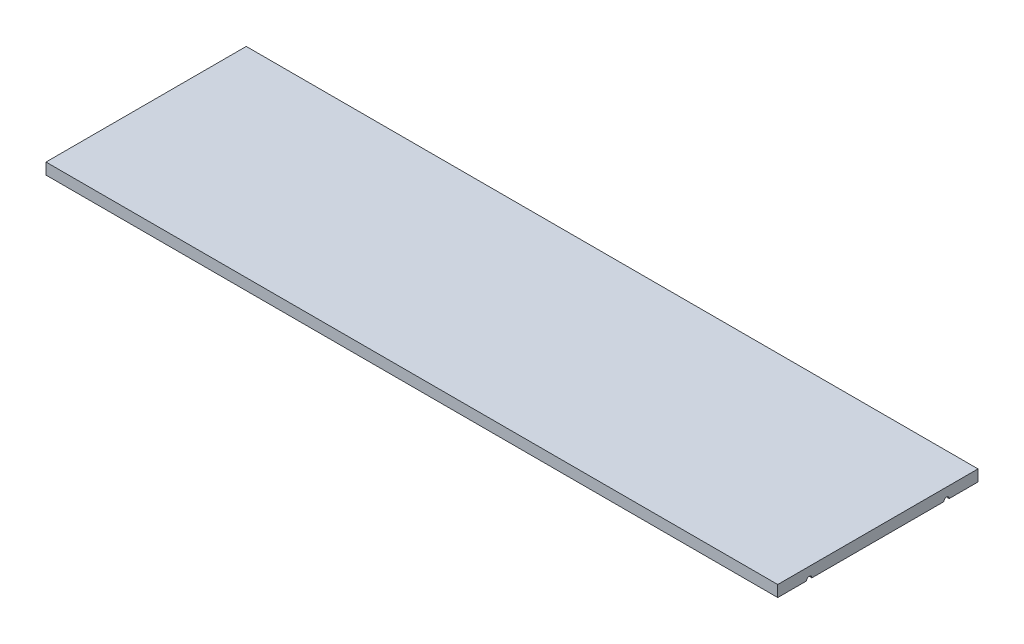
ISO-10303-21;
HEADER;
FILE_DESCRIPTION(('STEP AP214'),'2;1');
FILE_NAME('part.step','',(''),(''),'','','');
FILE_SCHEMA(('AUTOMOTIVE_DESIGN { 1 0 10303 214 1 1 1 1 }'));
ENDSEC;
DATA;
#1=APPLICATION_CONTEXT('core data for automotive mechanical design processes');
#2=APPLICATION_PROTOCOL_DEFINITION('international standard','automotive_design',2000,#1);
#3=PRODUCT_CONTEXT('',#1,'mechanical');
#4=PRODUCT('Part','Part','',(#3));
#5=PRODUCT_RELATED_PRODUCT_CATEGORY('part','',(#4));
#6=PRODUCT_DEFINITION_FORMATION('','',#4);
#7=PRODUCT_DEFINITION_CONTEXT('part definition',#1,'design');
#8=PRODUCT_DEFINITION('design','',#6,#7);
#9=PRODUCT_DEFINITION_SHAPE('','',#8);
#10=(LENGTH_UNIT() NAMED_UNIT(*) SI_UNIT(.MILLI.,.METRE.));
#11=(NAMED_UNIT(*) PLANE_ANGLE_UNIT() SI_UNIT($,.RADIAN.));
#12=(NAMED_UNIT(*) SI_UNIT($,.STERADIAN.) SOLID_ANGLE_UNIT());
#13=UNCERTAINTY_MEASURE_WITH_UNIT(LENGTH_MEASURE(1.E-05),#10,'distance_accuracy_value','');
#14=(GEOMETRIC_REPRESENTATION_CONTEXT(3) GLOBAL_UNCERTAINTY_ASSIGNED_CONTEXT((#13)) GLOBAL_UNIT_ASSIGNED_CONTEXT((#10,
#11,#12)) REPRESENTATION_CONTEXT('',''));
#15=CARTESIAN_POINT('',(0.,0.,0.));
#16=DIRECTION('',(0.,0.,1.));
#17=DIRECTION('',(1.,0.,0.));
#18=AXIS2_PLACEMENT_3D('',#15,#16,#17);
#19=CARTESIAN_POINT('',(-1162.,1204.72735504761,-318.));
#20=DIRECTION('',(1.,0.,0.));
#21=DIRECTION('',(0.,0.,-1.));
#22=AXIS2_PLACEMENT_3D('',#19,#20,#21);
#23=PLANE('',#22);
#24=CARTESIAN_POINT('',(-1162.,-18.,-268.));
#25=DIRECTION('',(1.,0.,0.));
#26=DIRECTION('',(0.,0.,-1.));
#27=AXIS2_PLACEMENT_3D('',#24,#25,#26);
#28=CIRCLE('',#27,4.24999999999995);
#29=CARTESIAN_POINT('',(-1162.,-18.,-272.25));
#30=VERTEX_POINT('',#29);
#31=CARTESIAN_POINT('',(-1162.,-18.,-263.75));
#32=VERTEX_POINT('',#31);
#33=EDGE_CURVE('E153',#30,#32,#28,.T.);
#34=ORIENTED_EDGE('',*,*,#33,.T.);
#35=DIRECTION('',(0.,0.,1.));
#36=VECTOR('',#35,1.);
#37=CARTESIAN_POINT('',(-1162.,-18.,-318.));
#38=LINE('',#37,#36);
#39=CARTESIAN_POINT('',(-1162.,-18.,-54.25));
#40=VERTEX_POINT('',#39);
#41=EDGE_CURVE('E185',#32,#40,#38,.T.);
#42=ORIENTED_EDGE('',*,*,#41,.T.);
#43=CARTESIAN_POINT('',(-1162.,-18.,-50.));
#44=DIRECTION('',(1.,0.,0.));
#45=DIRECTION('',(0.,0.,-1.));
#46=AXIS2_PLACEMENT_3D('',#43,#44,#45);
#47=CIRCLE('',#46,4.25);
#48=CARTESIAN_POINT('',(-1162.,-18.,-45.75));
#49=VERTEX_POINT('',#48);
#50=EDGE_CURVE('E159',#40,#49,#47,.T.);
#51=ORIENTED_EDGE('',*,*,#50,.T.);
#52=CARTESIAN_POINT('',(-1162.,-18.,0.));
#53=VERTEX_POINT('',#52);
#54=EDGE_CURVE('E186',#49,#53,#38,.T.);
#55=ORIENTED_EDGE('',*,*,#54,.T.);
#56=DIRECTION('',(0.,-1.,0.));
#57=VECTOR('',#56,1.);
#58=CARTESIAN_POINT('',(-1162.,1204.72735504761,0.));
#59=LINE('',#58,#57);
#60=CARTESIAN_POINT('',(-1162.,0.,0.));
#61=VERTEX_POINT('',#60);
#62=EDGE_CURVE('E181',#61,#53,#59,.T.);
#63=ORIENTED_EDGE('',*,*,#62,.F.);
#64=DIRECTION('',(0.,0.,1.));
#65=VECTOR('',#64,1.);
#66=CARTESIAN_POINT('',(-1162.,0.,-318.));
#67=LINE('',#66,#65);
#68=CARTESIAN_POINT('',(-1162.,0.,-318.));
#69=VERTEX_POINT('',#68);
#70=EDGE_CURVE('E194',#69,#61,#67,.T.);
#71=ORIENTED_EDGE('',*,*,#70,.F.);
#72=DIRECTION('',(0.,-1.,0.));
#73=VECTOR('',#72,1.);
#74=CARTESIAN_POINT('',(-1162.,1204.72735504761,-318.));
#75=LINE('',#74,#73);
#76=CARTESIAN_POINT('',(-1162.,-18.,-318.));
#77=VERTEX_POINT('',#76);
#78=EDGE_CURVE('E165',#69,#77,#75,.T.);
#79=ORIENTED_EDGE('',*,*,#78,.T.);
#80=EDGE_CURVE('E182',#77,#30,#38,.T.);
#81=ORIENTED_EDGE('',*,*,#80,.T.);
#82=EDGE_LOOP('',(#34,#42,#51,#55,#63,#71,#79,#81));
#83=FACE_BOUND('',#82,.T.);
#84=ADVANCED_FACE('F34',(#83),#23,.F.);
#85=CARTESIAN_POINT('',(-1162.,-18.,0.));
#86=DIRECTION('',(0.,1.,0.));
#87=DIRECTION('',(0.,0.,1.));
#88=AXIS2_PLACEMENT_3D('',#85,#86,#87);
#89=PLANE('',#88);
#90=DIRECTION('',(0.,0.,-1.));
#91=VECTOR('',#90,1.);
#92=CARTESIAN_POINT('',(-18.,-18.,-45.75));
#93=LINE('',#92,#91);
#94=CARTESIAN_POINT('',(-18.,-18.,-45.75));
#95=VERTEX_POINT('',#94);
#96=CARTESIAN_POINT('',(-18.,-18.,-54.25));
#97=VERTEX_POINT('',#96);
#98=EDGE_CURVE('E132',#95,#97,#93,.T.);
#99=ORIENTED_EDGE('',*,*,#98,.F.);
#100=DIRECTION('',(1.,0.,0.));
#101=VECTOR('',#100,1.);
#102=CARTESIAN_POINT('',(-18.,-18.,-45.75));
#103=LINE('',#102,#101);
#104=CARTESIAN_POINT('',(0.,-18.,-45.75));
#105=VERTEX_POINT('',#104);
#106=EDGE_CURVE('E122',#95,#105,#103,.T.);
#107=ORIENTED_EDGE('',*,*,#106,.T.);
#108=DIRECTION('',(0.,0.,-1.));
#109=VECTOR('',#108,1.);
#110=CARTESIAN_POINT('',(0.,-18.,-318.));
#111=LINE('',#110,#109);
#112=CARTESIAN_POINT('',(0.,-18.,0.));
#113=VERTEX_POINT('',#112);
#114=EDGE_CURVE('E173',#113,#105,#111,.T.);
#115=ORIENTED_EDGE('',*,*,#114,.F.);
#116=DIRECTION('',(1.,0.,0.));
#117=VECTOR('',#116,1.);
#118=CARTESIAN_POINT('',(-1162.,-18.,0.));
#119=LINE('',#118,#117);
#120=EDGE_CURVE('E177',#53,#113,#119,.T.);
#121=ORIENTED_EDGE('',*,*,#120,.F.);
#122=ORIENTED_EDGE('',*,*,#54,.F.);
#123=DIRECTION('',(-1.,0.,0.));
#124=VECTOR('',#123,1.);
#125=CARTESIAN_POINT('',(-1144.,-18.,-45.75));
#126=LINE('',#125,#124);
#127=CARTESIAN_POINT('',(-1144.,-18.,-45.75));
#128=VERTEX_POINT('',#127);
#129=EDGE_CURVE('E207',#128,#49,#126,.T.);
#130=ORIENTED_EDGE('',*,*,#129,.F.);
#131=DIRECTION('',(0.,0.,-1.));
#132=VECTOR('',#131,1.);
#133=CARTESIAN_POINT('',(-1144.,-18.,0.));
#134=LINE('',#133,#132);
#135=CARTESIAN_POINT('',(-1144.,-18.,-54.25));
#136=VERTEX_POINT('',#135);
#137=EDGE_CURVE('E190',#128,#136,#134,.T.);
#138=ORIENTED_EDGE('',*,*,#137,.T.);
#139=DIRECTION('',(-1.,0.,0.));
#140=VECTOR('',#139,1.);
#141=CARTESIAN_POINT('',(-1144.,-18.,-54.25));
#142=LINE('',#141,#140);
#143=EDGE_CURVE('E209',#40,#136,#142,.F.);
#144=ORIENTED_EDGE('',*,*,#143,.F.);
#145=ORIENTED_EDGE('',*,*,#41,.F.);
#146=DIRECTION('',(-1.,0.,0.));
#147=VECTOR('',#146,1.);
#148=CARTESIAN_POINT('',(-1144.,-18.,-263.75));
#149=LINE('',#148,#147);
#150=CARTESIAN_POINT('',(-1144.,-18.,-263.75));
#151=VERTEX_POINT('',#150);
#152=EDGE_CURVE('E42',#151,#32,#149,.T.);
#153=ORIENTED_EDGE('',*,*,#152,.F.);
#154=DIRECTION('',(0.,0.,-1.));
#155=VECTOR('',#154,1.);
#156=CARTESIAN_POINT('',(-1144.,-18.,0.));
#157=LINE('',#156,#155);
#158=CARTESIAN_POINT('',(-1144.,-18.,-272.25));
#159=VERTEX_POINT('',#158);
#160=EDGE_CURVE('E212',#151,#159,#157,.T.);
#161=ORIENTED_EDGE('',*,*,#160,.T.);
#162=DIRECTION('',(-1.,0.,0.));
#163=VECTOR('',#162,1.);
#164=CARTESIAN_POINT('',(-1144.,-18.,-272.25));
#165=LINE('',#164,#163);
#166=EDGE_CURVE('E11',#30,#159,#165,.F.);
#167=ORIENTED_EDGE('',*,*,#166,.F.);
#168=ORIENTED_EDGE('',*,*,#80,.F.);
#169=DIRECTION('',(-1.,0.,0.));
#170=VECTOR('',#169,1.);
#171=CARTESIAN_POINT('',(-1162.,-18.,-318.));
#172=LINE('',#171,#170);
#173=CARTESIAN_POINT('',(0.,-18.,-318.));
#174=VERTEX_POINT('',#173);
#175=EDGE_CURVE('E168',#174,#77,#172,.T.);
#176=ORIENTED_EDGE('',*,*,#175,.F.);
#177=CARTESIAN_POINT('',(0.,-18.,-272.25));
#178=VERTEX_POINT('',#177);
#179=EDGE_CURVE('E176',#178,#174,#111,.T.);
#180=ORIENTED_EDGE('',*,*,#179,.F.);
#181=DIRECTION('',(1.,0.,0.));
#182=VECTOR('',#181,1.);
#183=CARTESIAN_POINT('',(-18.,-18.,-272.25));
#184=LINE('',#183,#182);
#185=CARTESIAN_POINT('',(-18.,-18.,-272.25));
#186=VERTEX_POINT('',#185);
#187=EDGE_CURVE('E57',#186,#178,#184,.T.);
#188=ORIENTED_EDGE('',*,*,#187,.F.);
#189=DIRECTION('',(0.,0.,-1.));
#190=VECTOR('',#189,1.);
#191=CARTESIAN_POINT('',(-18.,-18.,-263.75));
#192=LINE('',#191,#190);
#193=CARTESIAN_POINT('',(-18.,-18.,-263.75));
#194=VERTEX_POINT('',#193);
#195=EDGE_CURVE('E147',#194,#186,#192,.T.);
#196=ORIENTED_EDGE('',*,*,#195,.F.);
#197=DIRECTION('',(1.,0.,0.));
#198=VECTOR('',#197,1.);
#199=CARTESIAN_POINT('',(-18.,-18.,-263.75));
#200=LINE('',#199,#198);
#201=CARTESIAN_POINT('',(0.,-18.,-263.75));
#202=VERTEX_POINT('',#201);
#203=EDGE_CURVE('E150',#194,#202,#200,.T.);
#204=ORIENTED_EDGE('',*,*,#203,.T.);
#205=CARTESIAN_POINT('',(0.,-18.,-54.25));
#206=VERTEX_POINT('',#205);
#207=EDGE_CURVE('E175',#206,#202,#111,.T.);
#208=ORIENTED_EDGE('',*,*,#207,.F.);
#209=DIRECTION('',(1.,0.,0.));
#210=VECTOR('',#209,1.);
#211=CARTESIAN_POINT('',(-18.,-18.,-54.25));
#212=LINE('',#211,#210);
#213=EDGE_CURVE('E49',#97,#206,#212,.T.);
#214=ORIENTED_EDGE('',*,*,#213,.F.);
#215=EDGE_LOOP('',(#99,#107,#115,#121,#122,#130,#138,#144,#145,#153,#161,#167,#168,#176,#180,
#188,#196,#204,#208,#214));
#216=FACE_BOUND('',#215,.T.);
#217=ADVANCED_FACE('F137',(#216),#89,.F.);
#218=CARTESIAN_POINT('',(-1162.,1204.72735504761,0.));
#219=DIRECTION('',(0.,0.,-1.));
#220=DIRECTION('',(-1.,0.,0.));
#221=AXIS2_PLACEMENT_3D('',#218,#219,#220);
#222=PLANE('',#221);
#223=DIRECTION('',(1.,0.,0.));
#224=VECTOR('',#223,1.);
#225=CARTESIAN_POINT('',(-1162.,0.,0.));
#226=LINE('',#225,#224);
#227=CARTESIAN_POINT('',(0.,0.,0.));
#228=VERTEX_POINT('',#227);
#229=EDGE_CURVE('E191',#61,#228,#226,.T.);
#230=ORIENTED_EDGE('',*,*,#229,.F.);
#231=ORIENTED_EDGE('',*,*,#62,.T.);
#232=ORIENTED_EDGE('',*,*,#120,.T.);
#233=DIRECTION('',(0.,-1.,0.));
#234=VECTOR('',#233,1.);
#235=CARTESIAN_POINT('',(0.,1204.72735504761,0.));
#236=LINE('',#235,#234);
#237=EDGE_CURVE('E180',#228,#113,#236,.T.);
#238=ORIENTED_EDGE('',*,*,#237,.F.);
#239=EDGE_LOOP('',(#230,#231,#232,#238));
#240=FACE_BOUND('',#239,.T.);
#241=ADVANCED_FACE('F229',(#240),#222,.F.);
#242=CARTESIAN_POINT('',(0.,1204.72735504761,-318.));
#243=DIRECTION('',(-1.,0.,0.));
#244=DIRECTION('',(0.,0.,1.));
#245=AXIS2_PLACEMENT_3D('',#242,#243,#244);
#246=PLANE('',#245);
#247=ORIENTED_EDGE('',*,*,#114,.T.);
#248=CARTESIAN_POINT('',(0.,-18.,-50.));
#249=DIRECTION('',(1.,0.,0.));
#250=DIRECTION('',(0.,0.,-1.));
#251=AXIS2_PLACEMENT_3D('',#248,#249,#250);
#252=CIRCLE('',#251,4.25);
#253=EDGE_CURVE('E127',#206,#105,#252,.T.);
#254=ORIENTED_EDGE('',*,*,#253,.F.);
#255=ORIENTED_EDGE('',*,*,#207,.T.);
#256=CARTESIAN_POINT('',(0.,-18.,-268.));
#257=DIRECTION('',(1.,0.,0.));
#258=DIRECTION('',(0.,0.,-1.));
#259=AXIS2_PLACEMENT_3D('',#256,#257,#258);
#260=CIRCLE('',#259,4.24999999999998);
#261=EDGE_CURVE('E142',#178,#202,#260,.T.);
#262=ORIENTED_EDGE('',*,*,#261,.F.);
#263=ORIENTED_EDGE('',*,*,#179,.T.);
#264=DIRECTION('',(0.,-1.,0.));
#265=VECTOR('',#264,1.);
#266=CARTESIAN_POINT('',(0.,1204.72735504761,-318.));
#267=LINE('',#266,#265);
#268=CARTESIAN_POINT('',(0.,0.,-318.));
#269=VERTEX_POINT('',#268);
#270=EDGE_CURVE('E172',#269,#174,#267,.T.);
#271=ORIENTED_EDGE('',*,*,#270,.F.);
#272=DIRECTION('',(0.,0.,-1.));
#273=VECTOR('',#272,1.);
#274=CARTESIAN_POINT('',(0.,0.,-318.));
#275=LINE('',#274,#273);
#276=EDGE_CURVE('E187',#228,#269,#275,.T.);
#277=ORIENTED_EDGE('',*,*,#276,.F.);
#278=ORIENTED_EDGE('',*,*,#237,.T.);
#279=EDGE_LOOP('',(#247,#254,#255,#262,#263,#271,#277,#278));
#280=FACE_BOUND('',#279,.T.);
#281=ADVANCED_FACE('F232',(#280),#246,.F.);
#282=CARTESIAN_POINT('',(-1162.,1204.72735504761,-318.));
#283=DIRECTION('',(0.,0.,1.));
#284=DIRECTION('',(1.,0.,0.));
#285=AXIS2_PLACEMENT_3D('',#282,#283,#284);
#286=PLANE('',#285);
#287=DIRECTION('',(-1.,0.,0.));
#288=VECTOR('',#287,1.);
#289=CARTESIAN_POINT('',(-1162.,0.,-318.));
#290=LINE('',#289,#288);
#291=EDGE_CURVE('E171',#269,#69,#290,.T.);
#292=ORIENTED_EDGE('',*,*,#291,.F.);
#293=ORIENTED_EDGE('',*,*,#270,.T.);
#294=ORIENTED_EDGE('',*,*,#175,.T.);
#295=ORIENTED_EDGE('',*,*,#78,.F.);
#296=EDGE_LOOP('',(#292,#293,#294,#295));
#297=FACE_BOUND('',#296,.T.);
#298=ADVANCED_FACE('F237',(#297),#286,.F.);
#299=CARTESIAN_POINT('',(0.,0.,0.));
#300=DIRECTION('',(0.,1.,0.));
#301=DIRECTION('',(0.,0.,1.));
#302=AXIS2_PLACEMENT_3D('',#299,#300,#301);
#303=PLANE('',#302);
#304=ORIENTED_EDGE('',*,*,#291,.T.);
#305=ORIENTED_EDGE('',*,*,#70,.T.);
#306=ORIENTED_EDGE('',*,*,#229,.T.);
#307=ORIENTED_EDGE('',*,*,#276,.T.);
#308=EDGE_LOOP('',(#304,#305,#306,#307));
#309=FACE_BOUND('',#308,.T.);
#310=ADVANCED_FACE('F36',(#309),#303,.T.);
#311=CARTESIAN_POINT('',(-1144.,-18.,-50.));
#312=DIRECTION('',(-1.,0.,0.));
#313=DIRECTION('',(0.,0.,1.));
#314=AXIS2_PLACEMENT_3D('',#311,#312,#313);
#315=CYLINDRICAL_SURFACE('',#314,4.25);
#316=ORIENTED_EDGE('',*,*,#143,.T.);
#317=CARTESIAN_POINT('',(-1144.,-18.,-50.));
#318=DIRECTION('',(1.,0.,0.));
#319=DIRECTION('',(0.,0.,-1.));
#320=AXIS2_PLACEMENT_3D('',#317,#318,#319);
#321=CIRCLE('',#320,4.25);
#322=EDGE_CURVE('E162',#136,#128,#321,.T.);
#323=ORIENTED_EDGE('',*,*,#322,.T.);
#324=ORIENTED_EDGE('',*,*,#129,.T.);
#325=ORIENTED_EDGE('',*,*,#50,.F.);
#326=EDGE_LOOP('',(#316,#323,#324,#325));
#327=FACE_BOUND('',#326,.T.);
#328=ADVANCED_FACE('F264',(#327),#315,.F.);
#329=CARTESIAN_POINT('',(-1144.,-18.,-50.));
#330=DIRECTION('',(1.,0.,0.));
#331=DIRECTION('',(0.,0.,-1.));
#332=AXIS2_PLACEMENT_3D('',#329,#330,#331);
#333=PLANE('',#332);
#334=ORIENTED_EDGE('',*,*,#322,.F.);
#335=ORIENTED_EDGE('',*,*,#137,.F.);
#336=EDGE_LOOP('',(#334,#335));
#337=FACE_BOUND('',#336,.T.);
#338=ADVANCED_FACE('F250',(#337),#333,.F.);
#339=CARTESIAN_POINT('',(-1144.,-18.,-268.));
#340=DIRECTION('',(-1.,0.,0.));
#341=DIRECTION('',(0.,0.,1.));
#342=AXIS2_PLACEMENT_3D('',#339,#340,#341);
#343=CYLINDRICAL_SURFACE('',#342,4.24999999999995);
#344=ORIENTED_EDGE('',*,*,#166,.T.);
#345=CARTESIAN_POINT('',(-1144.,-18.,-268.));
#346=DIRECTION('',(1.,0.,0.));
#347=DIRECTION('',(0.,0.,-1.));
#348=AXIS2_PLACEMENT_3D('',#345,#346,#347);
#349=CIRCLE('',#348,4.24999999999995);
#350=EDGE_CURVE('E156',#159,#151,#349,.T.);
#351=ORIENTED_EDGE('',*,*,#350,.T.);
#352=ORIENTED_EDGE('',*,*,#152,.T.);
#353=ORIENTED_EDGE('',*,*,#33,.F.);
#354=EDGE_LOOP('',(#344,#351,#352,#353));
#355=FACE_BOUND('',#354,.T.);
#356=ADVANCED_FACE('F216',(#355),#343,.F.);
#357=CARTESIAN_POINT('',(-1144.,-18.,-268.));
#358=DIRECTION('',(1.,0.,0.));
#359=DIRECTION('',(0.,0.,-1.));
#360=AXIS2_PLACEMENT_3D('',#357,#358,#359);
#361=PLANE('',#360);
#362=ORIENTED_EDGE('',*,*,#350,.F.);
#363=ORIENTED_EDGE('',*,*,#160,.F.);
#364=EDGE_LOOP('',(#362,#363));
#365=FACE_BOUND('',#364,.T.);
#366=ADVANCED_FACE('F240',(#365),#361,.F.);
#367=CARTESIAN_POINT('',(-18.,-18.,-268.));
#368=DIRECTION('',(1.,0.,0.));
#369=DIRECTION('',(0.,0.,-1.));
#370=AXIS2_PLACEMENT_3D('',#367,#368,#369);
#371=CYLINDRICAL_SURFACE('',#370,4.24999999999998);
#372=ORIENTED_EDGE('',*,*,#261,.T.);
#373=ORIENTED_EDGE('',*,*,#203,.F.);
#374=CARTESIAN_POINT('',(-18.,-18.,-268.));
#375=DIRECTION('',(1.,0.,0.));
#376=DIRECTION('',(0.,0.,-1.));
#377=AXIS2_PLACEMENT_3D('',#374,#375,#376);
#378=CIRCLE('',#377,4.24999999999998);
#379=EDGE_CURVE('E144',#186,#194,#378,.T.);
#380=ORIENTED_EDGE('',*,*,#379,.F.);
#381=ORIENTED_EDGE('',*,*,#187,.T.);
#382=EDGE_LOOP('',(#372,#373,#380,#381));
#383=FACE_BOUND('',#382,.T.);
#384=ADVANCED_FACE('F242',(#383),#371,.F.);
#385=CARTESIAN_POINT('',(-18.,-18.,-268.));
#386=DIRECTION('',(1.,0.,0.));
#387=DIRECTION('',(0.,0.,-1.));
#388=AXIS2_PLACEMENT_3D('',#385,#386,#387);
#389=PLANE('',#388);
#390=ORIENTED_EDGE('',*,*,#379,.T.);
#391=ORIENTED_EDGE('',*,*,#195,.T.);
#392=EDGE_LOOP('',(#390,#391));
#393=FACE_BOUND('',#392,.T.);
#394=ADVANCED_FACE('F248',(#393),#389,.T.);
#395=CARTESIAN_POINT('',(-18.,-18.,-50.));
#396=DIRECTION('',(1.,0.,0.));
#397=DIRECTION('',(0.,0.,-1.));
#398=AXIS2_PLACEMENT_3D('',#395,#396,#397);
#399=CYLINDRICAL_SURFACE('',#398,4.25);
#400=ORIENTED_EDGE('',*,*,#253,.T.);
#401=ORIENTED_EDGE('',*,*,#106,.F.);
#402=CARTESIAN_POINT('',(-18.,-18.,-50.));
#403=DIRECTION('',(1.,0.,0.));
#404=DIRECTION('',(0.,0.,-1.));
#405=AXIS2_PLACEMENT_3D('',#402,#403,#404);
#406=CIRCLE('',#405,4.25);
#407=EDGE_CURVE('E125',#97,#95,#406,.T.);
#408=ORIENTED_EDGE('',*,*,#407,.F.);
#409=ORIENTED_EDGE('',*,*,#213,.T.);
#410=EDGE_LOOP('',(#400,#401,#408,#409));
#411=FACE_BOUND('',#410,.T.);
#412=ADVANCED_FACE('F124',(#411),#399,.F.);
#413=CARTESIAN_POINT('',(-18.,-18.,-50.));
#414=DIRECTION('',(1.,0.,0.));
#415=DIRECTION('',(0.,0.,-1.));
#416=AXIS2_PLACEMENT_3D('',#413,#414,#415);
#417=PLANE('',#416);
#418=ORIENTED_EDGE('',*,*,#407,.T.);
#419=ORIENTED_EDGE('',*,*,#98,.T.);
#420=EDGE_LOOP('',(#418,#419));
#421=FACE_BOUND('',#420,.T.);
#422=ADVANCED_FACE('F135',(#421),#417,.T.);
#423=CLOSED_SHELL('',(#84,#217,#241,#281,#298,#310,#328,#338,#356,#366,#384,#394,#412,#422));
#424=MANIFOLD_SOLID_BREP('B2',#423);
#425=ADVANCED_BREP_SHAPE_REPRESENTATION('',(#18,#424),#14);
#426=SHAPE_DEFINITION_REPRESENTATION(#9,#425);
ENDSEC;
END-ISO-10303-21;
